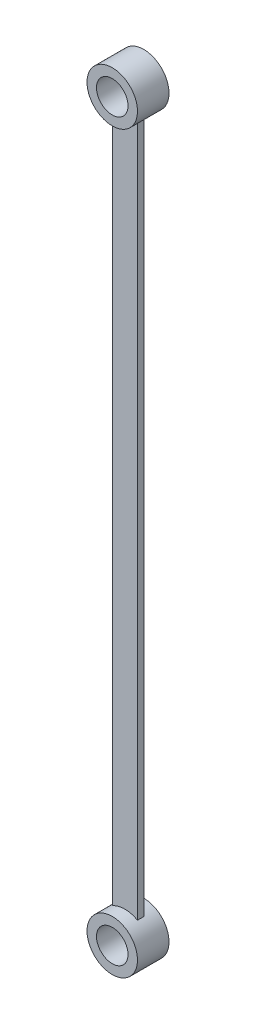
ISO-10303-21;
HEADER;
FILE_DESCRIPTION(('STEP AP214'),'2;1');
FILE_NAME('part.step','',(''),(''),'','','');
FILE_SCHEMA(('AUTOMOTIVE_DESIGN { 1 0 10303 214 1 1 1 1 }'));
ENDSEC;
DATA;
#1=APPLICATION_CONTEXT('core data for automotive mechanical design processes');
#2=APPLICATION_PROTOCOL_DEFINITION('international standard','automotive_design',2000,#1);
#3=PRODUCT_CONTEXT('',#1,'mechanical');
#4=PRODUCT('Part','Part','',(#3));
#5=PRODUCT_RELATED_PRODUCT_CATEGORY('part','',(#4));
#6=PRODUCT_DEFINITION_FORMATION('','',#4);
#7=PRODUCT_DEFINITION_CONTEXT('part definition',#1,'design');
#8=PRODUCT_DEFINITION('design','',#6,#7);
#9=PRODUCT_DEFINITION_SHAPE('','',#8);
#10=(LENGTH_UNIT() NAMED_UNIT(*) SI_UNIT(.MILLI.,.METRE.));
#11=(NAMED_UNIT(*) PLANE_ANGLE_UNIT() SI_UNIT($,.RADIAN.));
#12=(NAMED_UNIT(*) SI_UNIT($,.STERADIAN.) SOLID_ANGLE_UNIT());
#13=UNCERTAINTY_MEASURE_WITH_UNIT(LENGTH_MEASURE(1.E-05),#10,'distance_accuracy_value','');
#14=(GEOMETRIC_REPRESENTATION_CONTEXT(3) GLOBAL_UNCERTAINTY_ASSIGNED_CONTEXT((#13)) GLOBAL_UNIT_ASSIGNED_CONTEXT((#10,
#11,#12)) REPRESENTATION_CONTEXT('',''));
#15=CARTESIAN_POINT('',(0.,0.,0.));
#16=DIRECTION('',(0.,0.,1.));
#17=DIRECTION('',(1.,0.,0.));
#18=AXIS2_PLACEMENT_3D('',#15,#16,#17);
#19=CARTESIAN_POINT('',(0.,58.275,-2.5));
#20=DIRECTION('',(0.,0.,1.));
#21=DIRECTION('',(1.,0.,0.));
#22=AXIS2_PLACEMENT_3D('',#19,#20,#21);
#23=PLANE('',#22);
#24=CARTESIAN_POINT('',(0.,0.,-2.5));
#25=DIRECTION('',(0.,0.,1.));
#26=DIRECTION('',(-1.,0.,0.));
#27=AXIS2_PLACEMENT_3D('',#24,#25,#26);
#28=CIRCLE('',#27,2.5);
#29=CARTESIAN_POINT('',(2.5,0.,-2.5));
#30=VERTEX_POINT('',#29);
#31=EDGE_CURVE('E27',#30,#30,#28,.T.);
#32=ORIENTED_EDGE('',*,*,#31,.T.);
#33=EDGE_LOOP('',(#32));
#34=FACE_BOUND('',#33,.T.);
#35=CARTESIAN_POINT('',(0.,0.,-2.5));
#36=DIRECTION('',(0.,0.,1.));
#37=DIRECTION('',(1.,0.,0.));
#38=AXIS2_PLACEMENT_3D('',#35,#36,#37);
#39=CIRCLE('',#38,4.);
#40=CARTESIAN_POINT('',(2.,3.46410161513775,-2.5));
#41=VERTEX_POINT('',#40);
#42=EDGE_CURVE('E10',#41,#41,#39,.T.);
#43=ORIENTED_EDGE('',*,*,#42,.F.);
#44=EDGE_LOOP('',(#43));
#45=FACE_BOUND('',#44,.T.);
#46=ADVANCED_FACE('F16',(#34,#45),#23,.F.);
#47=CARTESIAN_POINT('',(0.,116.55,0.));
#48=DIRECTION('',(0.,0.,1.));
#49=DIRECTION('',(1.,0.,0.));
#50=AXIS2_PLACEMENT_3D('',#47,#48,#49);
#51=CYLINDRICAL_SURFACE('',#50,4.);
#52=CARTESIAN_POINT('',(0.,116.55,2.5));
#53=DIRECTION('',(0.,0.,-1.));
#54=DIRECTION('',(1.,0.,0.));
#55=AXIS2_PLACEMENT_3D('',#52,#53,#54);
#56=CIRCLE('',#55,4.);
#57=CARTESIAN_POINT('',(2.,113.085898384862,2.5));
#58=VERTEX_POINT('',#57);
#59=EDGE_CURVE('E137',#58,#58,#56,.T.);
#60=ORIENTED_EDGE('',*,*,#59,.T.);
#61=EDGE_LOOP('',(#60));
#62=FACE_BOUND('',#61,.T.);
#63=CARTESIAN_POINT('',(0.,116.55,-0.5));
#64=DIRECTION('',(0.,0.,1.));
#65=DIRECTION('',(-1.,0.,0.));
#66=AXIS2_PLACEMENT_3D('',#63,#64,#65);
#67=CIRCLE('',#66,4.);
#68=CARTESIAN_POINT('',(-2.,113.085898384862,-0.5));
#69=VERTEX_POINT('',#68);
#70=CARTESIAN_POINT('',(2.,113.085898384862,-0.5));
#71=VERTEX_POINT('',#70);
#72=EDGE_CURVE('E147',#69,#71,#67,.T.);
#73=ORIENTED_EDGE('',*,*,#72,.F.);
#74=DIRECTION('',(0.,0.,-1.));
#75=VECTOR('',#74,1.);
#76=CARTESIAN_POINT('',(-2.,113.085898384862,0.5));
#77=LINE('',#76,#75);
#78=CARTESIAN_POINT('',(-2.,113.085898384862,0.5));
#79=VERTEX_POINT('',#78);
#80=EDGE_CURVE('E103',#79,#69,#77,.T.);
#81=ORIENTED_EDGE('',*,*,#80,.F.);
#82=CARTESIAN_POINT('',(0.,116.55,0.5));
#83=DIRECTION('',(0.,0.,1.));
#84=DIRECTION('',(-1.,0.,0.));
#85=AXIS2_PLACEMENT_3D('',#82,#83,#84);
#86=CIRCLE('',#85,4.);
#87=CARTESIAN_POINT('',(2.,113.085898384862,0.5));
#88=VERTEX_POINT('',#87);
#89=EDGE_CURVE('E76',#79,#88,#86,.T.);
#90=ORIENTED_EDGE('',*,*,#89,.T.);
#91=DIRECTION('',(0.,0.,1.));
#92=VECTOR('',#91,1.);
#93=CARTESIAN_POINT('',(2.,113.085898384862,-0.5));
#94=LINE('',#93,#92);
#95=EDGE_CURVE('E125',#71,#88,#94,.T.);
#96=ORIENTED_EDGE('',*,*,#95,.F.);
#97=EDGE_LOOP('',(#73,#81,#90,#96));
#98=FACE_BOUND('',#97,.T.);
#99=CARTESIAN_POINT('',(0.,116.55,-2.5));
#100=DIRECTION('',(0.,0.,-1.));
#101=DIRECTION('',(-1.,0.,0.));
#102=AXIS2_PLACEMENT_3D('',#99,#100,#101);
#103=CIRCLE('',#102,4.);
#104=CARTESIAN_POINT('',(2.,113.085898384862,-2.5));
#105=VERTEX_POINT('',#104);
#106=EDGE_CURVE('E115',#105,#105,#103,.T.);
#107=ORIENTED_EDGE('',*,*,#106,.F.);
#108=EDGE_LOOP('',(#107));
#109=FACE_BOUND('',#108,.T.);
#110=ADVANCED_FACE('F180',(#62,#98,#109),#51,.T.);
#111=CARTESIAN_POINT('',(0.,0.,0.));
#112=DIRECTION('',(0.,0.,1.));
#113=DIRECTION('',(1.,0.,0.));
#114=AXIS2_PLACEMENT_3D('',#111,#112,#113);
#115=CYLINDRICAL_SURFACE('',#114,4.);
#116=ORIENTED_EDGE('',*,*,#42,.T.);
#117=EDGE_LOOP('',(#116));
#118=FACE_BOUND('',#117,.T.);
#119=DIRECTION('',(0.,0.,1.));
#120=VECTOR('',#119,1.);
#121=CARTESIAN_POINT('',(2.,3.46410161513775,-0.5));
#122=LINE('',#121,#120);
#123=CARTESIAN_POINT('',(2.,3.46410161513775,-0.5));
#124=VERTEX_POINT('',#123);
#125=CARTESIAN_POINT('',(2.,3.46410161513775,0.5));
#126=VERTEX_POINT('',#125);
#127=EDGE_CURVE('E20',#124,#126,#122,.T.);
#128=ORIENTED_EDGE('',*,*,#127,.T.);
#129=CARTESIAN_POINT('',(0.,0.,0.5));
#130=DIRECTION('',(0.,0.,1.));
#131=DIRECTION('',(-1.,0.,0.));
#132=AXIS2_PLACEMENT_3D('',#129,#130,#131);
#133=CIRCLE('',#132,4.);
#134=CARTESIAN_POINT('',(-2.,3.46410161513775,0.5));
#135=VERTEX_POINT('',#134);
#136=EDGE_CURVE('E131',#126,#135,#133,.T.);
#137=ORIENTED_EDGE('',*,*,#136,.T.);
#138=DIRECTION('',(0.,0.,1.));
#139=VECTOR('',#138,1.);
#140=CARTESIAN_POINT('',(-2.,3.46410161513775,-0.5));
#141=LINE('',#140,#139);
#142=CARTESIAN_POINT('',(-2.,3.46410161513775,-0.5));
#143=VERTEX_POINT('',#142);
#144=EDGE_CURVE('E87',#143,#135,#141,.T.);
#145=ORIENTED_EDGE('',*,*,#144,.F.);
#146=CARTESIAN_POINT('',(0.,0.,-0.5));
#147=DIRECTION('',(0.,0.,1.));
#148=DIRECTION('',(-1.,0.,0.));
#149=AXIS2_PLACEMENT_3D('',#146,#147,#148);
#150=CIRCLE('',#149,4.);
#151=EDGE_CURVE('E153',#124,#143,#150,.T.);
#152=ORIENTED_EDGE('',*,*,#151,.F.);
#153=EDGE_LOOP('',(#128,#137,#145,#152));
#154=FACE_BOUND('',#153,.T.);
#155=CARTESIAN_POINT('',(0.,0.,2.5));
#156=DIRECTION('',(0.,0.,1.));
#157=DIRECTION('',(-1.,0.,0.));
#158=AXIS2_PLACEMENT_3D('',#155,#156,#157);
#159=CIRCLE('',#158,4.);
#160=CARTESIAN_POINT('',(2.,3.46410161513775,2.5));
#161=VERTEX_POINT('',#160);
#162=EDGE_CURVE('E136',#161,#161,#159,.T.);
#163=ORIENTED_EDGE('',*,*,#162,.F.);
#164=EDGE_LOOP('',(#163));
#165=FACE_BOUND('',#164,.T.);
#166=ADVANCED_FACE('F183',(#118,#154,#165),#115,.T.);
#167=CARTESIAN_POINT('',(0.,116.55,0.));
#168=DIRECTION('',(0.,0.,1.));
#169=DIRECTION('',(-1.,0.,0.));
#170=AXIS2_PLACEMENT_3D('',#167,#168,#169);
#171=CYLINDRICAL_SURFACE('',#170,2.5);
#172=CARTESIAN_POINT('',(0.,116.55,2.5));
#173=DIRECTION('',(0.,0.,-1.));
#174=DIRECTION('',(-1.,0.,0.));
#175=AXIS2_PLACEMENT_3D('',#172,#173,#174);
#176=CIRCLE('',#175,2.5);
#177=CARTESIAN_POINT('',(2.5,116.55,2.5));
#178=VERTEX_POINT('',#177);
#179=EDGE_CURVE('E134',#178,#178,#176,.T.);
#180=ORIENTED_EDGE('',*,*,#179,.F.);
#181=EDGE_LOOP('',(#180));
#182=FACE_BOUND('',#181,.T.);
#183=CARTESIAN_POINT('',(0.,116.55,-2.5));
#184=DIRECTION('',(0.,0.,1.));
#185=DIRECTION('',(-1.,0.,0.));
#186=AXIS2_PLACEMENT_3D('',#183,#184,#185);
#187=CIRCLE('',#186,2.5);
#188=CARTESIAN_POINT('',(2.5,116.55,-2.5));
#189=VERTEX_POINT('',#188);
#190=EDGE_CURVE('E110',#189,#189,#187,.T.);
#191=ORIENTED_EDGE('',*,*,#190,.F.);
#192=EDGE_LOOP('',(#191));
#193=FACE_BOUND('',#192,.T.);
#194=ADVANCED_FACE('F205',(#182,#193),#171,.F.);
#195=CARTESIAN_POINT('',(0.,0.,0.));
#196=DIRECTION('',(0.,0.,1.));
#197=DIRECTION('',(-1.,0.,0.));
#198=AXIS2_PLACEMENT_3D('',#195,#196,#197);
#199=CYLINDRICAL_SURFACE('',#198,2.5);
#200=CARTESIAN_POINT('',(0.,0.,2.5));
#201=DIRECTION('',(0.,0.,-1.));
#202=DIRECTION('',(-1.,0.,0.));
#203=AXIS2_PLACEMENT_3D('',#200,#201,#202);
#204=CIRCLE('',#203,2.5);
#205=CARTESIAN_POINT('',(2.5,0.,2.5));
#206=VERTEX_POINT('',#205);
#207=EDGE_CURVE('E139',#206,#206,#204,.T.);
#208=ORIENTED_EDGE('',*,*,#207,.F.);
#209=EDGE_LOOP('',(#208));
#210=FACE_BOUND('',#209,.T.);
#211=ORIENTED_EDGE('',*,*,#31,.F.);
#212=EDGE_LOOP('',(#211));
#213=FACE_BOUND('',#212,.T.);
#214=ADVANCED_FACE('F206',(#210,#213),#199,.F.);
#215=CARTESIAN_POINT('',(0.,58.275,2.5));
#216=DIRECTION('',(0.,0.,1.));
#217=DIRECTION('',(1.,0.,0.));
#218=AXIS2_PLACEMENT_3D('',#215,#216,#217);
#219=PLANE('',#218);
#220=ORIENTED_EDGE('',*,*,#207,.T.);
#221=EDGE_LOOP('',(#220));
#222=FACE_BOUND('',#221,.T.);
#223=ORIENTED_EDGE('',*,*,#162,.T.);
#224=EDGE_LOOP('',(#223));
#225=FACE_BOUND('',#224,.T.);
#226=ADVANCED_FACE('F209',(#222,#225),#219,.T.);
#227=CARTESIAN_POINT('',(0.,58.275,2.5));
#228=DIRECTION('',(0.,0.,1.));
#229=DIRECTION('',(1.,0.,0.));
#230=AXIS2_PLACEMENT_3D('',#227,#228,#229);
#231=PLANE('',#230);
#232=ORIENTED_EDGE('',*,*,#179,.T.);
#233=EDGE_LOOP('',(#232));
#234=FACE_BOUND('',#233,.T.);
#235=ORIENTED_EDGE('',*,*,#59,.F.);
#236=EDGE_LOOP('',(#235));
#237=FACE_BOUND('',#236,.T.);
#238=ADVANCED_FACE('F214',(#234,#237),#231,.T.);
#239=CARTESIAN_POINT('',(-2.,3.46410161513775,0.));
#240=DIRECTION('',(-1.,0.,0.));
#241=DIRECTION('',(0.,0.,1.));
#242=AXIS2_PLACEMENT_3D('',#239,#240,#241);
#243=PLANE('',#242);
#244=DIRECTION('',(0.,-1.,0.));
#245=VECTOR('',#244,1.);
#246=CARTESIAN_POINT('',(-2.,113.085898384862,-0.5));
#247=LINE('',#246,#245);
#248=EDGE_CURVE('E130',#69,#143,#247,.T.);
#249=ORIENTED_EDGE('',*,*,#248,.T.);
#250=ORIENTED_EDGE('',*,*,#144,.T.);
#251=DIRECTION('',(0.,1.,0.));
#252=VECTOR('',#251,1.);
#253=CARTESIAN_POINT('',(-2.,3.46410161513775,0.5));
#254=LINE('',#253,#252);
#255=EDGE_CURVE('E121',#135,#79,#254,.T.);
#256=ORIENTED_EDGE('',*,*,#255,.T.);
#257=ORIENTED_EDGE('',*,*,#80,.T.);
#258=EDGE_LOOP('',(#249,#250,#256,#257));
#259=FACE_BOUND('',#258,.T.);
#260=ADVANCED_FACE('F194',(#259),#243,.T.);
#261=CARTESIAN_POINT('',(0.,58.275,0.5));
#262=DIRECTION('',(0.,0.,1.));
#263=DIRECTION('',(1.,0.,0.));
#264=AXIS2_PLACEMENT_3D('',#261,#262,#263);
#265=PLANE('',#264);
#266=ORIENTED_EDGE('',*,*,#89,.F.);
#267=ORIENTED_EDGE('',*,*,#255,.F.);
#268=ORIENTED_EDGE('',*,*,#136,.F.);
#269=DIRECTION('',(0.,-1.,0.));
#270=VECTOR('',#269,1.);
#271=CARTESIAN_POINT('',(2.,113.085898384862,0.5));
#272=LINE('',#271,#270);
#273=EDGE_CURVE('E129',#88,#126,#272,.T.);
#274=ORIENTED_EDGE('',*,*,#273,.F.);
#275=EDGE_LOOP('',(#266,#267,#268,#274));
#276=FACE_BOUND('',#275,.T.);
#277=ADVANCED_FACE('F18',(#276),#265,.T.);
#278=CARTESIAN_POINT('',(0.,58.275,-2.5));
#279=DIRECTION('',(0.,0.,1.));
#280=DIRECTION('',(1.,0.,0.));
#281=AXIS2_PLACEMENT_3D('',#278,#279,#280);
#282=PLANE('',#281);
#283=ORIENTED_EDGE('',*,*,#190,.T.);
#284=EDGE_LOOP('',(#283));
#285=FACE_BOUND('',#284,.T.);
#286=ORIENTED_EDGE('',*,*,#106,.T.);
#287=EDGE_LOOP('',(#286));
#288=FACE_BOUND('',#287,.T.);
#289=ADVANCED_FACE('F111',(#285,#288),#282,.F.);
#290=CARTESIAN_POINT('',(2.,113.085898384862,0.));
#291=DIRECTION('',(1.,0.,0.));
#292=DIRECTION('',(0.,1.,0.));
#293=AXIS2_PLACEMENT_3D('',#290,#291,#292);
#294=PLANE('',#293);
#295=DIRECTION('',(0.,1.,0.));
#296=VECTOR('',#295,1.);
#297=CARTESIAN_POINT('',(2.,3.46410161513775,-0.5));
#298=LINE('',#297,#296);
#299=EDGE_CURVE('E151',#124,#71,#298,.T.);
#300=ORIENTED_EDGE('',*,*,#299,.T.);
#301=ORIENTED_EDGE('',*,*,#95,.T.);
#302=ORIENTED_EDGE('',*,*,#273,.T.);
#303=ORIENTED_EDGE('',*,*,#127,.F.);
#304=EDGE_LOOP('',(#300,#301,#302,#303));
#305=FACE_BOUND('',#304,.T.);
#306=ADVANCED_FACE('F175',(#305),#294,.T.);
#307=CARTESIAN_POINT('',(-2.,113.085898384862,-0.5));
#308=CARTESIAN_POINT('',(-2.,3.46410161513775,-0.5));
#309=CARTESIAN_POINT('',(2.,113.085898384862,-0.5));
#310=CARTESIAN_POINT('',(2.,3.46410161513775,-0.5));
#311=(BOUNDED_SURFACE() B_SPLINE_SURFACE(1,1,((#307,#308),(#309,#310)),.UNSPECIFIED.,.F.,.F.,
.F.) B_SPLINE_SURFACE_WITH_KNOTS((2,2),(2,2),(0.,4.),(0.,109.621796769724),
.UNSPECIFIED.) GEOMETRIC_REPRESENTATION_ITEM() RATIONAL_B_SPLINE_SURFACE(((1.,1.),(1.,1.))) REPRESENTATION_ITEM('') SURFACE());
#312=ORIENTED_EDGE('',*,*,#72,.T.);
#313=ORIENTED_EDGE('',*,*,#299,.F.);
#314=ORIENTED_EDGE('',*,*,#151,.T.);
#315=ORIENTED_EDGE('',*,*,#248,.F.);
#316=EDGE_LOOP('',(#312,#313,#314,#315));
#317=FACE_BOUND('',#316,.T.);
#318=ADVANCED_FACE('F179',(#317),#311,.T.);
#319=CLOSED_SHELL('',(#46,#110,#166,#194,#214,#226,#238,#260,#277,#289,#306,#318));
#320=MANIFOLD_SOLID_BREP('B1',#319);
#321=ADVANCED_BREP_SHAPE_REPRESENTATION('',(#18,#320),#14);
#322=SHAPE_DEFINITION_REPRESENTATION(#9,#321);
ENDSEC;
END-ISO-10303-21;
